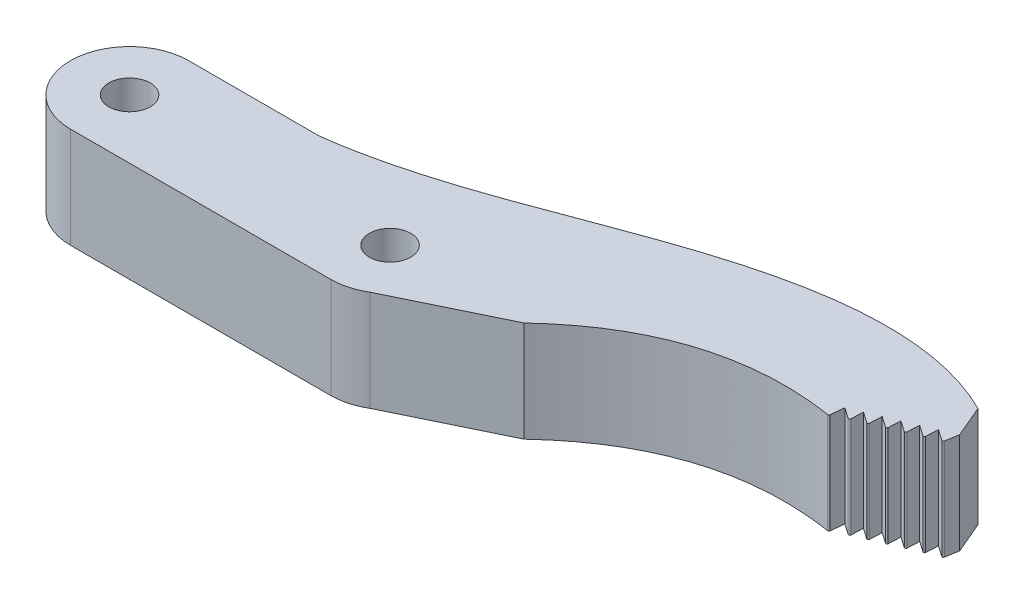
ISO-10303-21;
HEADER;
FILE_DESCRIPTION(('STEP AP214'),'2;1');
FILE_NAME('part.step','',(''),(''),'','','');
FILE_SCHEMA(('AUTOMOTIVE_DESIGN { 1 0 10303 214 1 1 1 1 }'));
ENDSEC;
DATA;
#1=APPLICATION_CONTEXT('core data for automotive mechanical design processes');
#2=APPLICATION_PROTOCOL_DEFINITION('international standard','automotive_design',2000,#1);
#3=PRODUCT_CONTEXT('',#1,'mechanical');
#4=PRODUCT('Part','Part','',(#3));
#5=PRODUCT_RELATED_PRODUCT_CATEGORY('part','',(#4));
#6=PRODUCT_DEFINITION_FORMATION('','',#4);
#7=PRODUCT_DEFINITION_CONTEXT('part definition',#1,'design');
#8=PRODUCT_DEFINITION('design','',#6,#7);
#9=PRODUCT_DEFINITION_SHAPE('','',#8);
#10=(LENGTH_UNIT() NAMED_UNIT(*) SI_UNIT(.MILLI.,.METRE.));
#11=(NAMED_UNIT(*) PLANE_ANGLE_UNIT() SI_UNIT($,.RADIAN.));
#12=(NAMED_UNIT(*) SI_UNIT($,.STERADIAN.) SOLID_ANGLE_UNIT());
#13=UNCERTAINTY_MEASURE_WITH_UNIT(LENGTH_MEASURE(1.E-05),#10,'distance_accuracy_value','');
#14=(GEOMETRIC_REPRESENTATION_CONTEXT(3) GLOBAL_UNCERTAINTY_ASSIGNED_CONTEXT((#13)) GLOBAL_UNIT_ASSIGNED_CONTEXT((#10,
#11,#12)) REPRESENTATION_CONTEXT('',''));
#15=CARTESIAN_POINT('',(0.,0.,0.));
#16=DIRECTION('',(0.,0.,1.));
#17=DIRECTION('',(1.,0.,0.));
#18=AXIS2_PLACEMENT_3D('',#15,#16,#17);
#19=CARTESIAN_POINT('',(0.,8.5,0.));
#20=DIRECTION('',(0.,1.,0.));
#21=DIRECTION('',(0.,0.,1.));
#22=AXIS2_PLACEMENT_3D('',#19,#20,#21);
#23=PLANE('',#22);
#24=CARTESIAN_POINT('',(0.,8.5,0.));
#25=DIRECTION('',(0.,1.,0.));
#26=DIRECTION('',(0.,0.,1.));
#27=AXIS2_PLACEMENT_3D('',#24,#25,#26);
#28=CIRCLE('',#27,1.75);
#29=CARTESIAN_POINT('',(0.,8.5,1.75));
#30=VERTEX_POINT('',#29);
#31=EDGE_CURVE('E632',#30,#30,#28,.T.);
#32=ORIENTED_EDGE('',*,*,#31,.F.);
#33=EDGE_LOOP('',(#32));
#34=FACE_BOUND('',#33,.T.);
#35=CARTESIAN_POINT('',(22.,8.5,0.));
#36=DIRECTION('',(0.,1.,0.));
#37=DIRECTION('',(0.,0.,1.));
#38=AXIS2_PLACEMENT_3D('',#35,#36,#37);
#39=CIRCLE('',#38,1.75);
#40=CARTESIAN_POINT('',(22.,8.5,1.75));
#41=VERTEX_POINT('',#40);
#42=EDGE_CURVE('E624',#41,#41,#39,.T.);
#43=ORIENTED_EDGE('',*,*,#42,.F.);
#44=EDGE_LOOP('',(#43));
#45=FACE_BOUND('',#44,.T.);
#46=DIRECTION('',(0.820739161225916,0.,0.571303097514953));
#47=VECTOR('',#46,1.);
#48=CARTESIAN_POINT('',(23.6778354912223,8.5,-34.015791136512));
#49=LINE('',#48,#47);
#50=CARTESIAN_POINT('',(58.6481039931561,8.5,-9.67355957265818));
#51=VERTEX_POINT('',#50);
#52=CARTESIAN_POINT('',(59.5739181305044,8.5,-9.02911550397233));
#53=VERTEX_POINT('',#52);
#54=EDGE_CURVE('E318',#51,#53,#49,.T.);
#55=ORIENTED_EDGE('',*,*,#54,.T.);
#56=CARTESIAN_POINT('',(59.6310484402559,8.5,-9.11118942009492));
#57=DIRECTION('',(0.,1.,0.));
#58=DIRECTION('',(0.,0.,1.));
#59=AXIS2_PLACEMENT_3D('',#56,#57,#58);
#60=CIRCLE('',#59,0.1);
#61=CARTESIAN_POINT('',(59.729767794205,8.5,-9.09523670384068));
#62=VERTEX_POINT('',#61);
#63=EDGE_CURVE('E701',#53,#62,#60,.T.);
#64=ORIENTED_EDGE('',*,*,#63,.T.);
#65=DIRECTION('',(0.159527162542443,0.,-0.987193539490184));
#66=VECTOR('',#65,1.);
#67=CARTESIAN_POINT('',(56.7773540427395,8.5,9.17502984448575));
#68=LINE('',#67,#66);
#69=CARTESIAN_POINT('',(59.9096296005443,8.5,-10.2082660487461));
#70=VERTEX_POINT('',#69);
#71=EDGE_CURVE('E370',#62,#70,#68,.T.);
#72=ORIENTED_EDGE('',*,*,#71,.T.);
#73=DIRECTION('',(-0.39024909973652,0.,-0.920709313602744));
#74=VECTOR('',#73,1.);
#75=CARTESIAN_POINT('',(60.3346865912055,8.5,-9.20543495860924));
#76=LINE('',#75,#74);
#77=CARTESIAN_POINT('',(58.7736901922594,8.5,-12.8882722130202));
#78=VERTEX_POINT('',#77);
#79=EDGE_CURVE('E592',#70,#78,#76,.T.);
#80=ORIENTED_EDGE('',*,*,#79,.T.);
#81=CARTESIAN_POINT('',(58.7736901922594,8.5,-12.8882722130202));
#82=CARTESIAN_POINT('',(52.7742242431908,8.5,-15.8907993993144));
#83=CARTESIAN_POINT('',(35.6036156525737,8.5,-14.5978462371183));
#84=CARTESIAN_POINT('',(21.1527610788369,8.5,-6.29600031117131));
#85=CARTESIAN_POINT('',(11.,8.5,-5.));
#86=B_SPLINE_CURVE_WITH_KNOTS('',3,(#81,#82,#83,#84,#85),.UNSPECIFIED.,.F.,.F.,(4,1,4),(0.,
0.39213618372464,1.),.UNSPECIFIED.);
#87=CARTESIAN_POINT('',(11.,8.5,-5.));
#88=VERTEX_POINT('',#87);
#89=EDGE_CURVE('E439',#78,#88,#86,.T.);
#90=ORIENTED_EDGE('',*,*,#89,.T.);
#91=DIRECTION('',(-1.,0.,0.));
#92=VECTOR('',#91,1.);
#93=CARTESIAN_POINT('',(0.,8.5,-5.));
#94=LINE('',#93,#92);
#95=CARTESIAN_POINT('',(0.,8.5,-5.));
#96=VERTEX_POINT('',#95);
#97=EDGE_CURVE('E651',#88,#96,#94,.T.);
#98=ORIENTED_EDGE('',*,*,#97,.T.);
#99=CARTESIAN_POINT('',(0.,8.5,0.));
#100=DIRECTION('',(0.,1.,0.));
#101=DIRECTION('',(0.,0.,1.));
#102=AXIS2_PLACEMENT_3D('',#99,#100,#101);
#103=CIRCLE('',#102,5.);
#104=CARTESIAN_POINT('',(0.,8.5,5.));
#105=VERTEX_POINT('',#104);
#106=EDGE_CURVE('E640',#96,#105,#103,.T.);
#107=ORIENTED_EDGE('',*,*,#106,.T.);
#108=DIRECTION('',(1.,0.,0.));
#109=VECTOR('',#108,1.);
#110=CARTESIAN_POINT('',(0.,8.5,5.));
#111=LINE('',#110,#109);
#112=CARTESIAN_POINT('',(22.,8.5,5.));
#113=VERTEX_POINT('',#112);
#114=EDGE_CURVE('E644',#105,#113,#111,.T.);
#115=ORIENTED_EDGE('',*,*,#114,.T.);
#116=CARTESIAN_POINT('',(22.,8.5,0.));
#117=DIRECTION('',(0.,1.,0.));
#118=DIRECTION('',(0.,0.,1.));
#119=AXIS2_PLACEMENT_3D('',#116,#117,#118);
#120=CIRCLE('',#119,5.);
#121=CARTESIAN_POINT('',(24.5933863620115,8.5,4.27485054444392));
#122=VERTEX_POINT('',#121);
#123=EDGE_CURVE('E648',#113,#122,#120,.T.);
#124=ORIENTED_EDGE('',*,*,#123,.T.);
#125=DIRECTION('',(0.89955777895518,0.,-0.436801788367704));
#126=VECTOR('',#125,1.);
#127=CARTESIAN_POINT('',(24.1790120823835,8.5,4.47605988377656));
#128=LINE('',#127,#126);
#129=CARTESIAN_POINT('',(33.3415575685287,8.5,0.0269668427524081));
#130=VERTEX_POINT('',#129);
#131=EDGE_CURVE('E390',#122,#130,#128,.T.);
#132=ORIENTED_EDGE('',*,*,#131,.T.);
#133=CARTESIAN_POINT('',(33.3415575685287,8.5,0.0269668427524081));
#134=CARTESIAN_POINT('',(41.7498204729618,8.5,-7.89313442016116));
#135=CARTESIAN_POINT('',(52.9690120823835,8.5,-6.08344216071709));
#136=B_SPLINE_CURVE_WITH_KNOTS('',2,(#133,#134,#135),.UNSPECIFIED.,.F.,.F.,(3,3),(0.,1.),.UNSPECIFIED.);
#137=CARTESIAN_POINT('',(52.8645896871265,8.5,-6.10008469831257));
#138=VERTEX_POINT('',#137);
#139=EDGE_CURVE('E586',#130,#138,#136,.T.);
#140=ORIENTED_EDGE('',*,*,#139,.T.);
#141=CARTESIAN_POINT('',(52.8801429505113,8.5,-6.19886777377635));
#142=DIRECTION('',(0.,1.,0.));
#143=DIRECTION('',(0.,0.,1.));
#144=AXIS2_PLACEMENT_3D('',#141,#142,#143);
#145=CIRCLE('',#144,0.1);
#146=CARTESIAN_POINT('',(52.9796385017408,8.5,-6.18883605978845));
#147=VERTEX_POINT('',#146);
#148=EDGE_CURVE('E588',#138,#147,#145,.T.);
#149=ORIENTED_EDGE('',*,*,#148,.T.);
#150=DIRECTION('',(0.100317139878992,0.,-0.994955512295147));
#151=VECTOR('',#150,1.);
#152=CARTESIAN_POINT('',(51.8287619159183,8.5,5.2256740071528));
#153=LINE('',#152,#151);
#154=CARTESIAN_POINT('',(53.0936133138799,8.5,-7.31924974320675));
#155=VERTEX_POINT('',#154);
#156=EDGE_CURVE('E376',#147,#155,#153,.T.);
#157=ORIENTED_EDGE('',*,*,#156,.T.);
#158=DIRECTION('',(0.8242757676216,0.,0.566188536542221));
#159=VECTOR('',#158,1.);
#160=CARTESIAN_POINT('',(20.4360517412647,8.5,-29.7514717254073));
#161=LINE('',#160,#159);
#162=CARTESIAN_POINT('',(54.0082692399699,8.5,-6.69097978723458));
#163=VERTEX_POINT('',#162);
#164=EDGE_CURVE('E380',#155,#163,#161,.T.);
#165=ORIENTED_EDGE('',*,*,#164,.T.);
#166=CARTESIAN_POINT('',(54.0648880936241,8.5,-6.77340736399674));
#167=DIRECTION('',(0.,1.,0.));
#168=DIRECTION('',(0.,0.,1.));
#169=AXIS2_PLACEMENT_3D('',#166,#167,#168);
#170=CIRCLE('',#169,0.1);
#171=CARTESIAN_POINT('',(54.1648307920072,8.5,-6.77002253905194));
#172=VERTEX_POINT('',#171);
#173=EDGE_CURVE('E686',#163,#172,#170,.T.);
#174=ORIENTED_EDGE('',*,*,#173,.T.);
#175=DIRECTION('',(0.0338482494481111,0.,-0.999426983830884));
#176=VECTOR('',#175,1.);
#177=CARTESIAN_POINT('',(53.8737518261521,8.5,1.82457770304288));
#178=LINE('',#177,#176);
#179=CARTESIAN_POINT('',(54.1993040690976,8.5,-7.78790452429312));
#180=VERTEX_POINT('',#179);
#181=EDGE_CURVE('E358',#172,#180,#178,.T.);
#182=ORIENTED_EDGE('',*,*,#181,.T.);
#183=DIRECTION('',(0.820739161225914,0.,0.571303097514955));
#184=VECTOR('',#183,1.);
#185=CARTESIAN_POINT('',(21.3416376592027,8.5,-30.6595883477472));
#186=LINE('',#185,#184);
#187=CARTESIAN_POINT('',(55.1069626425986,8.5,-7.1560982464586));
#188=VERTEX_POINT('',#187);
#189=EDGE_CURVE('E352',#180,#188,#186,.T.);
#190=ORIENTED_EDGE('',*,*,#189,.T.);
#191=CARTESIAN_POINT('',(55.1640929523501,8.5,-7.2381721625812));
#192=DIRECTION('',(0.,1.,0.));
#193=DIRECTION('',(0.,0.,1.));
#194=AXIS2_PLACEMENT_3D('',#191,#192,#193);
#195=CIRCLE('',#194,0.1);
#196=CARTESIAN_POINT('',(55.2639858277884,8.5,-7.23354469711193));
#197=VERTEX_POINT('',#196);
#198=EDGE_CURVE('E689',#188,#197,#195,.T.);
#199=ORIENTED_EDGE('',*,*,#198,.T.);
#200=DIRECTION('',(0.0462746546926032,0.,-0.998928754382954));
#201=VECTOR('',#200,1.);
#202=CARTESIAN_POINT('',(54.811275436478,8.5,2.53909283615619));
#203=LINE('',#202,#201);
#204=CARTESIAN_POINT('',(55.3115040501122,8.5,-8.25931828638438));
#205=VERTEX_POINT('',#204);
#206=EDGE_CURVE('E396',#197,#205,#203,.T.);
#207=ORIENTED_EDGE('',*,*,#206,.T.);
#208=DIRECTION('',(0.820739161225915,0.,0.571303097514954));
#209=VECTOR('',#208,1.);
#210=CARTESIAN_POINT('',(21.9256871172076,8.5,-31.4986390449384));
#211=LINE('',#210,#209);
#212=CARTESIAN_POINT('',(56.2191626236133,8.5,-7.62751200854987));
#213=VERTEX_POINT('',#212);
#214=EDGE_CURVE('E399',#205,#213,#211,.T.);
#215=ORIENTED_EDGE('',*,*,#214,.T.);
#216=CARTESIAN_POINT('',(56.2762929333648,8.5,-7.70958592467246));
#217=DIRECTION('',(0.,1.,0.));
#218=DIRECTION('',(0.,0.,1.));
#219=AXIS2_PLACEMENT_3D('',#216,#217,#218);
#220=CIRCLE('',#219,0.1);
#221=CARTESIAN_POINT('',(56.3761858088031,8.5,-7.7049584592032));
#222=VERTEX_POINT('',#221);
#223=EDGE_CURVE('E692',#213,#222,#220,.T.);
#224=ORIENTED_EDGE('',*,*,#223,.T.);
#225=DIRECTION('',(0.0462746546926031,0.,-0.998928754382954));
#226=VECTOR('',#225,1.);
#227=CARTESIAN_POINT('',(55.899302674746,8.5,2.58949491390806));
#228=LINE('',#227,#226);
#229=CARTESIAN_POINT('',(56.4237040311268,8.5,-8.73073204847565));
#230=VERTEX_POINT('',#229);
#231=EDGE_CURVE('E341',#222,#230,#228,.T.);
#232=ORIENTED_EDGE('',*,*,#231,.T.);
#233=DIRECTION('',(0.820739161225914,0.,0.571303097514955));
#234=VECTOR('',#233,1.);
#235=CARTESIAN_POINT('',(22.5097365752126,8.5,-32.3376897421296));
#236=LINE('',#235,#234);
#237=CARTESIAN_POINT('',(57.3313626046279,8.5,-8.09892577064114));
#238=VERTEX_POINT('',#237);
#239=EDGE_CURVE('E320',#230,#238,#236,.T.);
#240=ORIENTED_EDGE('',*,*,#239,.T.);
#241=CARTESIAN_POINT('',(57.3884929143794,8.5,-8.18099968676373));
#242=DIRECTION('',(0.,1.,0.));
#243=DIRECTION('',(0.,0.,1.));
#244=AXIS2_PLACEMENT_3D('',#241,#242,#243);
#245=CIRCLE('',#244,0.1);
#246=CARTESIAN_POINT('',(57.4883857898177,8.5,-8.17637222129447));
#247=VERTEX_POINT('',#246);
#248=EDGE_CURVE('E695',#238,#247,#245,.T.);
#249=ORIENTED_EDGE('',*,*,#248,.T.);
#250=DIRECTION('',(0.0462746546926033,0.,-0.998928754382954));
#251=VECTOR('',#250,1.);
#252=CARTESIAN_POINT('',(56.9873299130141,8.5,2.63989699165996));
#253=LINE('',#252,#251);
#254=CARTESIAN_POINT('',(57.5359040121415,8.5,-9.20214581056691));
#255=VERTEX_POINT('',#254);
#256=EDGE_CURVE('E414',#247,#255,#253,.T.);
#257=ORIENTED_EDGE('',*,*,#256,.T.);
#258=DIRECTION('',(0.820739161225915,0.,0.571303097514954));
#259=VECTOR('',#258,1.);
#260=CARTESIAN_POINT('',(23.0937860332174,8.5,-33.1767404393208));
#261=LINE('',#260,#259);
#262=CARTESIAN_POINT('',(58.4435625856425,8.5,-8.5703395327324));
#263=VERTEX_POINT('',#262);
#264=EDGE_CURVE('E417',#255,#263,#261,.T.);
#265=ORIENTED_EDGE('',*,*,#264,.T.);
#266=CARTESIAN_POINT('',(58.500692895394,8.5,-8.65241344885499));
#267=DIRECTION('',(0.,1.,0.));
#268=DIRECTION('',(0.,0.,1.));
#269=AXIS2_PLACEMENT_3D('',#266,#267,#268);
#270=CIRCLE('',#269,0.1);
#271=CARTESIAN_POINT('',(58.6005857708323,8.5,-8.64778598338573));
#272=VERTEX_POINT('',#271);
#273=EDGE_CURVE('E698',#263,#272,#270,.T.);
#274=ORIENTED_EDGE('',*,*,#273,.T.);
#275=DIRECTION('',(0.0462746546926032,0.,-0.998928754382954));
#276=VECTOR('',#275,1.);
#277=CARTESIAN_POINT('',(58.0753571512821,8.5,2.69029906941183));
#278=LINE('',#277,#276);
#279=EDGE_CURVE('E327',#272,#51,#278,.T.);
#280=ORIENTED_EDGE('',*,*,#279,.T.);
#281=EDGE_LOOP('',(#55,#64,#72,#80,#90,#98,#107,#115,#124,#132,#140,#149,#157,#165,#174,#182,
#190,#199,#207,#215,#224,#232,#240,#249,#257,#265,#274,#280));
#282=FACE_BOUND('',#281,.T.);
#283=ADVANCED_FACE('F113',(#34,#45,#282),#23,.T.);
#284=CARTESIAN_POINT('',(0.,0.,0.));
#285=DIRECTION('',(0.,1.,0.));
#286=DIRECTION('',(0.,0.,1.));
#287=AXIS2_PLACEMENT_3D('',#284,#285,#286);
#288=PLANE('',#287);
#289=CARTESIAN_POINT('',(22.,0.,0.));
#290=DIRECTION('',(0.,1.,0.));
#291=DIRECTION('',(0.,0.,1.));
#292=AXIS2_PLACEMENT_3D('',#289,#290,#291);
#293=CIRCLE('',#292,1.75);
#294=CARTESIAN_POINT('',(22.,0.,1.75));
#295=VERTEX_POINT('',#294);
#296=EDGE_CURVE('E615',#295,#295,#293,.T.);
#297=ORIENTED_EDGE('',*,*,#296,.T.);
#298=EDGE_LOOP('',(#297));
#299=FACE_BOUND('',#298,.T.);
#300=CARTESIAN_POINT('',(0.,0.,0.));
#301=DIRECTION('',(0.,1.,0.));
#302=DIRECTION('',(0.,0.,1.));
#303=AXIS2_PLACEMENT_3D('',#300,#301,#302);
#304=CIRCLE('',#303,1.75);
#305=CARTESIAN_POINT('',(0.,0.,1.75));
#306=VERTEX_POINT('',#305);
#307=EDGE_CURVE('E628',#306,#306,#304,.T.);
#308=ORIENTED_EDGE('',*,*,#307,.T.);
#309=EDGE_LOOP('',(#308));
#310=FACE_BOUND('',#309,.T.);
#311=DIRECTION('',(0.159527162542443,0.,-0.987193539490184));
#312=VECTOR('',#311,1.);
#313=CARTESIAN_POINT('',(56.7773540427395,0.,9.17502984448575));
#314=LINE('',#313,#312);
#315=CARTESIAN_POINT('',(59.729767794205,0.,-9.09523670384068));
#316=VERTEX_POINT('',#315);
#317=CARTESIAN_POINT('',(59.9096296005443,0.,-10.2082660487461));
#318=VERTEX_POINT('',#317);
#319=EDGE_CURVE('E427',#316,#318,#314,.T.);
#320=ORIENTED_EDGE('',*,*,#319,.F.);
#321=CARTESIAN_POINT('',(59.6310484402559,0.,-9.11118942009492));
#322=DIRECTION('',(0.,1.,0.));
#323=DIRECTION('',(0.,0.,1.));
#324=AXIS2_PLACEMENT_3D('',#321,#322,#323);
#325=CIRCLE('',#324,0.1);
#326=CARTESIAN_POINT('',(59.5739181305044,0.,-9.02911550397233));
#327=VERTEX_POINT('',#326);
#328=EDGE_CURVE('E325',#316,#327,#325,.F.);
#329=ORIENTED_EDGE('',*,*,#328,.T.);
#330=DIRECTION('',(0.820739161225916,0.,0.571303097514953));
#331=VECTOR('',#330,1.);
#332=CARTESIAN_POINT('',(23.6778354912223,0.,-34.015791136512));
#333=LINE('',#332,#331);
#334=CARTESIAN_POINT('',(58.6481039931561,0.,-9.67355957265818));
#335=VERTEX_POINT('',#334);
#336=EDGE_CURVE('E310',#335,#327,#333,.T.);
#337=ORIENTED_EDGE('',*,*,#336,.F.);
#338=DIRECTION('',(0.0462746546926032,0.,-0.998928754382954));
#339=VECTOR('',#338,1.);
#340=CARTESIAN_POINT('',(58.0753571512821,0.,2.69029906941183));
#341=LINE('',#340,#339);
#342=CARTESIAN_POINT('',(58.6005857708323,0.,-8.64778598338573));
#343=VERTEX_POINT('',#342);
#344=EDGE_CURVE('E299',#343,#335,#341,.T.);
#345=ORIENTED_EDGE('',*,*,#344,.F.);
#346=CARTESIAN_POINT('',(58.500692895394,0.,-8.65241344885499));
#347=DIRECTION('',(0.,1.,0.));
#348=DIRECTION('',(0.,0.,1.));
#349=AXIS2_PLACEMENT_3D('',#346,#347,#348);
#350=CIRCLE('',#349,0.1);
#351=CARTESIAN_POINT('',(58.4435625856425,0.,-8.5703395327324));
#352=VERTEX_POINT('',#351);
#353=EDGE_CURVE('E543',#343,#352,#350,.F.);
#354=ORIENTED_EDGE('',*,*,#353,.T.);
#355=DIRECTION('',(0.820739161225915,0.,0.571303097514954));
#356=VECTOR('',#355,1.);
#357=CARTESIAN_POINT('',(23.0937860332174,0.,-33.1767404393208));
#358=LINE('',#357,#356);
#359=CARTESIAN_POINT('',(57.5359040121415,0.,-9.20214581056691));
#360=VERTEX_POINT('',#359);
#361=EDGE_CURVE('E409',#360,#352,#358,.T.);
#362=ORIENTED_EDGE('',*,*,#361,.F.);
#363=DIRECTION('',(0.0462746546926033,0.,-0.998928754382954));
#364=VECTOR('',#363,1.);
#365=CARTESIAN_POINT('',(56.9873299130141,0.,2.63989699165996));
#366=LINE('',#365,#364);
#367=CARTESIAN_POINT('',(57.4883857898177,0.,-8.17637222129447));
#368=VERTEX_POINT('',#367);
#369=EDGE_CURVE('E413',#368,#360,#366,.T.);
#370=ORIENTED_EDGE('',*,*,#369,.F.);
#371=CARTESIAN_POINT('',(57.3884929143794,0.,-8.18099968676373));
#372=DIRECTION('',(0.,1.,0.));
#373=DIRECTION('',(0.,0.,1.));
#374=AXIS2_PLACEMENT_3D('',#371,#372,#373);
#375=CIRCLE('',#374,0.1);
#376=CARTESIAN_POINT('',(57.3313626046279,0.,-8.09892577064114));
#377=VERTEX_POINT('',#376);
#378=EDGE_CURVE('E541',#368,#377,#375,.F.);
#379=ORIENTED_EDGE('',*,*,#378,.T.);
#380=DIRECTION('',(0.820739161225914,0.,0.571303097514955));
#381=VECTOR('',#380,1.);
#382=CARTESIAN_POINT('',(22.5097365752126,0.,-32.3376897421296));
#383=LINE('',#382,#381);
#384=CARTESIAN_POINT('',(56.4237040311268,0.,-8.73073204847565));
#385=VERTEX_POINT('',#384);
#386=EDGE_CURVE('E336',#385,#377,#383,.T.);
#387=ORIENTED_EDGE('',*,*,#386,.F.);
#388=DIRECTION('',(0.0462746546926031,0.,-0.998928754382954));
#389=VECTOR('',#388,1.);
#390=CARTESIAN_POINT('',(55.899302674746,0.,2.58949491390806));
#391=LINE('',#390,#389);
#392=CARTESIAN_POINT('',(56.3761858088031,0.,-7.7049584592032));
#393=VERTEX_POINT('',#392);
#394=EDGE_CURVE('E340',#393,#385,#391,.T.);
#395=ORIENTED_EDGE('',*,*,#394,.F.);
#396=CARTESIAN_POINT('',(56.2762929333648,0.,-7.70958592467246));
#397=DIRECTION('',(0.,1.,0.));
#398=DIRECTION('',(0.,0.,1.));
#399=AXIS2_PLACEMENT_3D('',#396,#397,#398);
#400=CIRCLE('',#399,0.1);
#401=CARTESIAN_POINT('',(56.2191626236133,0.,-7.62751200854987));
#402=VERTEX_POINT('',#401);
#403=EDGE_CURVE('E532',#393,#402,#400,.F.);
#404=ORIENTED_EDGE('',*,*,#403,.T.);
#405=DIRECTION('',(0.820739161225915,0.,0.571303097514954));
#406=VECTOR('',#405,1.);
#407=CARTESIAN_POINT('',(21.9256871172076,0.,-31.4986390449384));
#408=LINE('',#407,#406);
#409=CARTESIAN_POINT('',(55.3115040501122,0.,-8.25931828638438));
#410=VERTEX_POINT('',#409);
#411=EDGE_CURVE('E391',#410,#402,#408,.T.);
#412=ORIENTED_EDGE('',*,*,#411,.F.);
#413=DIRECTION('',(0.0462746546926032,0.,-0.998928754382954));
#414=VECTOR('',#413,1.);
#415=CARTESIAN_POINT('',(54.811275436478,0.,2.53909283615619));
#416=LINE('',#415,#414);
#417=CARTESIAN_POINT('',(55.2639858277884,0.,-7.23354469711193));
#418=VERTEX_POINT('',#417);
#419=EDGE_CURVE('E395',#418,#410,#416,.T.);
#420=ORIENTED_EDGE('',*,*,#419,.F.);
#421=CARTESIAN_POINT('',(55.1640929523501,0.,-7.2381721625812));
#422=DIRECTION('',(0.,1.,0.));
#423=DIRECTION('',(0.,0.,1.));
#424=AXIS2_PLACEMENT_3D('',#421,#422,#423);
#425=CIRCLE('',#424,0.1);
#426=CARTESIAN_POINT('',(55.1069626425986,0.,-7.1560982464586));
#427=VERTEX_POINT('',#426);
#428=EDGE_CURVE('E529',#418,#427,#425,.F.);
#429=ORIENTED_EDGE('',*,*,#428,.T.);
#430=DIRECTION('',(0.820739161225914,0.,0.571303097514955));
#431=VECTOR('',#430,1.);
#432=CARTESIAN_POINT('',(21.3416376592027,0.,-30.6595883477472));
#433=LINE('',#432,#431);
#434=CARTESIAN_POINT('',(54.1993040690976,0.,-7.78790452429312));
#435=VERTEX_POINT('',#434);
#436=EDGE_CURVE('E353',#435,#427,#433,.T.);
#437=ORIENTED_EDGE('',*,*,#436,.F.);
#438=DIRECTION('',(0.0338482494481111,0.,-0.999426983830884));
#439=VECTOR('',#438,1.);
#440=CARTESIAN_POINT('',(53.8737518261521,0.,1.82457770304288));
#441=LINE('',#440,#439);
#442=CARTESIAN_POINT('',(54.1648307920072,0.,-6.77002253905194));
#443=VERTEX_POINT('',#442);
#444=EDGE_CURVE('E357',#443,#435,#441,.T.);
#445=ORIENTED_EDGE('',*,*,#444,.F.);
#446=CARTESIAN_POINT('',(54.0648880936241,0.,-6.77340736399674));
#447=DIRECTION('',(0.,1.,0.));
#448=DIRECTION('',(0.,0.,1.));
#449=AXIS2_PLACEMENT_3D('',#446,#447,#448);
#450=CIRCLE('',#449,0.1);
#451=CARTESIAN_POINT('',(54.0082692399699,0.,-6.69097978723458));
#452=VERTEX_POINT('',#451);
#453=EDGE_CURVE('E522',#443,#452,#450,.F.);
#454=ORIENTED_EDGE('',*,*,#453,.T.);
#455=DIRECTION('',(0.8242757676216,0.,0.566188536542221));
#456=VECTOR('',#455,1.);
#457=CARTESIAN_POINT('',(20.4360517412647,0.,-29.7514717254073));
#458=LINE('',#457,#456);
#459=CARTESIAN_POINT('',(53.0936133138799,0.,-7.31924974320675));
#460=VERTEX_POINT('',#459);
#461=EDGE_CURVE('E371',#460,#452,#458,.T.);
#462=ORIENTED_EDGE('',*,*,#461,.F.);
#463=DIRECTION('',(0.100317139878992,0.,-0.994955512295147));
#464=VECTOR('',#463,1.);
#465=CARTESIAN_POINT('',(51.8287619159183,0.,5.2256740071528));
#466=LINE('',#465,#464);
#467=CARTESIAN_POINT('',(52.9796385017408,0.,-6.18883605978845));
#468=VERTEX_POINT('',#467);
#469=EDGE_CURVE('E375',#468,#460,#466,.T.);
#470=ORIENTED_EDGE('',*,*,#469,.F.);
#471=CARTESIAN_POINT('',(52.8801429505113,0.,-6.19886777377635));
#472=DIRECTION('',(0.,1.,0.));
#473=DIRECTION('',(0.,0.,1.));
#474=AXIS2_PLACEMENT_3D('',#471,#472,#473);
#475=CIRCLE('',#474,0.1);
#476=CARTESIAN_POINT('',(52.8645896871265,0.,-6.10008469831257));
#477=VERTEX_POINT('',#476);
#478=EDGE_CURVE('E129',#468,#477,#475,.F.);
#479=ORIENTED_EDGE('',*,*,#478,.T.);
#480=CARTESIAN_POINT('',(33.3415575685287,0.,0.0269668427524081));
#481=CARTESIAN_POINT('',(41.7498204729618,0.,-7.89313442016116));
#482=CARTESIAN_POINT('',(52.9690120823835,0.,-6.08344216071709));
#483=B_SPLINE_CURVE_WITH_KNOTS('',2,(#480,#481,#482),.UNSPECIFIED.,.F.,.F.,(3,3),(0.,1.),.UNSPECIFIED.);
#484=CARTESIAN_POINT('',(33.3415575685287,0.,0.0269668427524081));
#485=VERTEX_POINT('',#484);
#486=EDGE_CURVE('E438',#485,#477,#483,.T.);
#487=ORIENTED_EDGE('',*,*,#486,.F.);
#488=DIRECTION('',(0.89955777895518,0.,-0.436801788367704));
#489=VECTOR('',#488,1.);
#490=CARTESIAN_POINT('',(24.1790120823835,0.,4.47605988377656));
#491=LINE('',#490,#489);
#492=CARTESIAN_POINT('',(24.5933863620115,0.,4.27485054444392));
#493=VERTEX_POINT('',#492);
#494=EDGE_CURVE('E435',#493,#485,#491,.T.);
#495=ORIENTED_EDGE('',*,*,#494,.F.);
#496=CARTESIAN_POINT('',(22.,0.,0.));
#497=DIRECTION('',(0.,1.,0.));
#498=DIRECTION('',(0.,0.,1.));
#499=AXIS2_PLACEMENT_3D('',#496,#497,#498);
#500=CIRCLE('',#499,5.);
#501=CARTESIAN_POINT('',(22.,0.,5.));
#502=VERTEX_POINT('',#501);
#503=EDGE_CURVE('E660',#502,#493,#500,.T.);
#504=ORIENTED_EDGE('',*,*,#503,.F.);
#505=DIRECTION('',(1.,0.,0.));
#506=VECTOR('',#505,1.);
#507=CARTESIAN_POINT('',(0.,0.,5.));
#508=LINE('',#507,#506);
#509=CARTESIAN_POINT('',(0.,0.,5.));
#510=VERTEX_POINT('',#509);
#511=EDGE_CURVE('E658',#510,#502,#508,.T.);
#512=ORIENTED_EDGE('',*,*,#511,.F.);
#513=CARTESIAN_POINT('',(0.,0.,0.));
#514=DIRECTION('',(0.,1.,0.));
#515=DIRECTION('',(0.,0.,1.));
#516=AXIS2_PLACEMENT_3D('',#513,#514,#515);
#517=CIRCLE('',#516,5.);
#518=CARTESIAN_POINT('',(0.,0.,-5.));
#519=VERTEX_POINT('',#518);
#520=EDGE_CURVE('E636',#519,#510,#517,.T.);
#521=ORIENTED_EDGE('',*,*,#520,.F.);
#522=DIRECTION('',(-1.,0.,0.));
#523=VECTOR('',#522,1.);
#524=CARTESIAN_POINT('',(0.,0.,-5.));
#525=LINE('',#524,#523);
#526=CARTESIAN_POINT('',(11.,0.,-5.));
#527=VERTEX_POINT('',#526);
#528=EDGE_CURVE('E645',#527,#519,#525,.T.);
#529=ORIENTED_EDGE('',*,*,#528,.F.);
#530=CARTESIAN_POINT('',(58.7736901922594,0.,-12.8882722130202));
#531=CARTESIAN_POINT('',(52.7742242431908,0.,-15.8907993993144));
#532=CARTESIAN_POINT('',(35.6036156525737,0.,-14.5978462371183));
#533=CARTESIAN_POINT('',(21.1527610788369,0.,-6.29600031117131));
#534=CARTESIAN_POINT('',(11.,0.,-5.));
#535=B_SPLINE_CURVE_WITH_KNOTS('',3,(#530,#531,#532,#533,#534),.UNSPECIFIED.,.F.,.F.,(4,1,4),
(0.,0.39213618372464,1.),.UNSPECIFIED.);
#536=CARTESIAN_POINT('',(58.7736901922594,0.,-12.8882722130202));
#537=VERTEX_POINT('',#536);
#538=EDGE_CURVE('E623',#537,#527,#535,.T.);
#539=ORIENTED_EDGE('',*,*,#538,.F.);
#540=DIRECTION('',(-0.39024909973652,0.,-0.920709313602744));
#541=VECTOR('',#540,1.);
#542=CARTESIAN_POINT('',(60.3346865912055,0.,-9.20543495860924));
#543=LINE('',#542,#541);
#544=EDGE_CURVE('E445',#318,#537,#543,.T.);
#545=ORIENTED_EDGE('',*,*,#544,.F.);
#546=EDGE_LOOP('',(#320,#329,#337,#345,#354,#362,#370,#379,#387,#395,#404,#412,#420,#429,#437,
#445,#454,#462,#470,#479,#487,#495,#504,#512,#521,#529,#539,#545));
#547=FACE_BOUND('',#546,.T.);
#548=ADVANCED_FACE('F323',(#299,#310,#547),#288,.F.);
#549=CARTESIAN_POINT('',(60.3346865912055,0.,-9.20543495860924));
#550=DIRECTION('',(0.920709313602744,0.,-0.39024909973652));
#551=DIRECTION('',(-0.39024909973652,0.,-0.920709313602744));
#552=AXIS2_PLACEMENT_3D('',#549,#550,#551);
#553=PLANE('',#552);
#554=ORIENTED_EDGE('',*,*,#79,.F.);
#555=DIRECTION('',(0.,1.,0.));
#556=VECTOR('',#555,1.);
#557=CARTESIAN_POINT('',(59.9096296005443,0.,-10.2082660487461));
#558=LINE('',#557,#556);
#559=EDGE_CURVE('E421',#318,#70,#558,.T.);
#560=ORIENTED_EDGE('',*,*,#559,.F.);
#561=ORIENTED_EDGE('',*,*,#544,.T.);
#562=DIRECTION('',(0.,1.,0.));
#563=VECTOR('',#562,1.);
#564=CARTESIAN_POINT('',(58.7736901922594,0.,-12.8882722130202));
#565=LINE('',#564,#563);
#566=EDGE_CURVE('E616',#537,#78,#565,.T.);
#567=ORIENTED_EDGE('',*,*,#566,.T.);
#568=EDGE_LOOP('',(#554,#560,#561,#567));
#569=FACE_BOUND('',#568,.T.);
#570=ADVANCED_FACE('F458',(#569),#553,.T.);
#571=CARTESIAN_POINT('',(0.,8.5,0.));
#572=DIRECTION('',(0.,-1.,0.));
#573=DIRECTION('',(0.,0.,-1.));
#574=AXIS2_PLACEMENT_3D('',#571,#572,#573);
#575=CYLINDRICAL_SURFACE('',#574,5.);
#576=ORIENTED_EDGE('',*,*,#520,.T.);
#577=DIRECTION('',(0.,-1.,0.));
#578=VECTOR('',#577,1.);
#579=CARTESIAN_POINT('',(0.,8.5,5.));
#580=LINE('',#579,#578);
#581=EDGE_CURVE('E673',#105,#510,#580,.T.);
#582=ORIENTED_EDGE('',*,*,#581,.F.);
#583=ORIENTED_EDGE('',*,*,#106,.F.);
#584=DIRECTION('',(0.,-1.,0.));
#585=VECTOR('',#584,1.);
#586=CARTESIAN_POINT('',(0.,8.5,-5.));
#587=LINE('',#586,#585);
#588=EDGE_CURVE('E654',#96,#519,#587,.T.);
#589=ORIENTED_EDGE('',*,*,#588,.T.);
#590=EDGE_LOOP('',(#576,#582,#583,#589));
#591=FACE_BOUND('',#590,.T.);
#592=ADVANCED_FACE('F489',(#591),#575,.T.);
#593=CARTESIAN_POINT('',(0.,8.5,5.));
#594=DIRECTION('',(0.,0.,-1.));
#595=DIRECTION('',(-1.,0.,0.));
#596=AXIS2_PLACEMENT_3D('',#593,#594,#595);
#597=PLANE('',#596);
#598=ORIENTED_EDGE('',*,*,#511,.T.);
#599=DIRECTION('',(0.,-1.,0.));
#600=VECTOR('',#599,1.);
#601=CARTESIAN_POINT('',(22.,8.5,5.));
#602=LINE('',#601,#600);
#603=EDGE_CURVE('E669',#113,#502,#602,.T.);
#604=ORIENTED_EDGE('',*,*,#603,.F.);
#605=ORIENTED_EDGE('',*,*,#114,.F.);
#606=ORIENTED_EDGE('',*,*,#581,.T.);
#607=EDGE_LOOP('',(#598,#604,#605,#606));
#608=FACE_BOUND('',#607,.T.);
#609=ADVANCED_FACE('F485',(#608),#597,.F.);
#610=CARTESIAN_POINT('',(22.,8.5,0.));
#611=DIRECTION('',(0.,-1.,0.));
#612=DIRECTION('',(0.,0.,-1.));
#613=AXIS2_PLACEMENT_3D('',#610,#611,#612);
#614=CYLINDRICAL_SURFACE('',#613,5.);
#615=ORIENTED_EDGE('',*,*,#503,.T.);
#616=DIRECTION('',(0.,-1.,0.));
#617=VECTOR('',#616,1.);
#618=CARTESIAN_POINT('',(24.5933863620115,8.5,4.27485054444393));
#619=LINE('',#618,#617);
#620=EDGE_CURVE('E677',#493,#122,#619,.F.);
#621=ORIENTED_EDGE('',*,*,#620,.T.);
#622=ORIENTED_EDGE('',*,*,#123,.F.);
#623=ORIENTED_EDGE('',*,*,#603,.T.);
#624=EDGE_LOOP('',(#615,#621,#622,#623));
#625=FACE_BOUND('',#624,.T.);
#626=ADVANCED_FACE('F481',(#625),#614,.T.);
#627=CARTESIAN_POINT('',(0.,8.5,-5.));
#628=DIRECTION('',(0.,0.,1.));
#629=DIRECTION('',(1.,0.,0.));
#630=AXIS2_PLACEMENT_3D('',#627,#628,#629);
#631=PLANE('',#630);
#632=ORIENTED_EDGE('',*,*,#97,.F.);
#633=DIRECTION('',(0.,1.,0.));
#634=VECTOR('',#633,1.);
#635=CARTESIAN_POINT('',(11.,0.,-5.));
#636=LINE('',#635,#634);
#637=EDGE_CURVE('E608',#527,#88,#636,.T.);
#638=ORIENTED_EDGE('',*,*,#637,.F.);
#639=ORIENTED_EDGE('',*,*,#528,.T.);
#640=ORIENTED_EDGE('',*,*,#588,.F.);
#641=EDGE_LOOP('',(#632,#638,#639,#640));
#642=FACE_BOUND('',#641,.T.);
#643=ADVANCED_FACE('F471',(#642),#631,.F.);
#644=CARTESIAN_POINT('',(0.,8.5,0.));
#645=DIRECTION('',(0.,-1.,0.));
#646=DIRECTION('',(0.,0.,-1.));
#647=AXIS2_PLACEMENT_3D('',#644,#645,#646);
#648=CYLINDRICAL_SURFACE('',#647,1.75);
#649=ORIENTED_EDGE('',*,*,#31,.T.);
#650=EDGE_LOOP('',(#649));
#651=FACE_BOUND('',#650,.T.);
#652=ORIENTED_EDGE('',*,*,#307,.F.);
#653=EDGE_LOOP('',(#652));
#654=FACE_BOUND('',#653,.T.);
#655=ADVANCED_FACE('F467',(#651,#654),#648,.F.);
#656=CARTESIAN_POINT('',(22.,8.5,0.));
#657=DIRECTION('',(0.,-1.,0.));
#658=DIRECTION('',(0.,0.,-1.));
#659=AXIS2_PLACEMENT_3D('',#656,#657,#658);
#660=CYLINDRICAL_SURFACE('',#659,1.75);
#661=ORIENTED_EDGE('',*,*,#42,.T.);
#662=EDGE_LOOP('',(#661));
#663=FACE_BOUND('',#662,.T.);
#664=ORIENTED_EDGE('',*,*,#296,.F.);
#665=EDGE_LOOP('',(#664));
#666=FACE_BOUND('',#665,.T.);
#667=ADVANCED_FACE('F463',(#663,#666),#660,.F.);
#668=CARTESIAN_POINT('',(24.1790120823835,0.,4.47605988377656));
#669=DIRECTION('',(0.436801788367704,0.,0.89955777895518));
#670=DIRECTION('',(0.89955777895518,0.,-0.436801788367704));
#671=AXIS2_PLACEMENT_3D('',#668,#669,#670);
#672=PLANE('',#671);
#673=ORIENTED_EDGE('',*,*,#620,.F.);
#674=ORIENTED_EDGE('',*,*,#494,.T.);
#675=DIRECTION('',(0.,1.,0.));
#676=VECTOR('',#675,1.);
#677=CARTESIAN_POINT('',(33.3415575685287,0.,0.0269668427524081));
#678=LINE('',#677,#676);
#679=EDGE_CURVE('E620',#485,#130,#678,.T.);
#680=ORIENTED_EDGE('',*,*,#679,.T.);
#681=ORIENTED_EDGE('',*,*,#131,.F.);
#682=EDGE_LOOP('',(#673,#674,#680,#681));
#683=FACE_BOUND('',#682,.T.);
#684=ADVANCED_FACE('F460',(#683),#672,.T.);
#685=DIRECTION('',(0.,1.,0.));
#686=VECTOR('',#685,1.);
#687=SURFACE_OF_LINEAR_EXTRUSION('',#535,#686);
#688=ORIENTED_EDGE('',*,*,#89,.F.);
#689=ORIENTED_EDGE('',*,*,#566,.F.);
#690=ORIENTED_EDGE('',*,*,#538,.T.);
#691=ORIENTED_EDGE('',*,*,#637,.T.);
#692=EDGE_LOOP('',(#688,#689,#690,#691));
#693=FACE_BOUND('',#692,.T.);
#694=ADVANCED_FACE('F456',(#693),#687,.T.);
#695=DIRECTION('',(0.,1.,0.));
#696=VECTOR('',#695,1.);
#697=SURFACE_OF_LINEAR_EXTRUSION('',#483,#696);
#698=ORIENTED_EDGE('',*,*,#486,.T.);
#699=DIRECTION('',(0.,1.,0.));
#700=VECTOR('',#699,1.);
#701=CARTESIAN_POINT('',(52.8645896871265,0.,-6.10008469831257));
#702=LINE('',#701,#700);
#703=EDGE_CURVE('E122',#477,#138,#702,.T.);
#704=ORIENTED_EDGE('',*,*,#703,.T.);
#705=ORIENTED_EDGE('',*,*,#139,.F.);
#706=ORIENTED_EDGE('',*,*,#679,.F.);
#707=EDGE_LOOP('',(#698,#704,#705,#706));
#708=FACE_BOUND('',#707,.T.);
#709=ADVANCED_FACE('F451',(#708),#697,.T.);
#710=CARTESIAN_POINT('',(20.4360517412647,0.,-29.7514717254073));
#711=DIRECTION('',(-0.566188536542221,0.,0.8242757676216));
#712=DIRECTION('',(0.8242757676216,0.,0.566188536542221));
#713=AXIS2_PLACEMENT_3D('',#710,#711,#712);
#714=PLANE('',#713);
#715=ORIENTED_EDGE('',*,*,#461,.T.);
#716=DIRECTION('',(0.,1.,0.));
#717=VECTOR('',#716,1.);
#718=CARTESIAN_POINT('',(54.0082692399699,0.,-6.69097978723459));
#719=LINE('',#718,#717);
#720=EDGE_CURVE('E525',#452,#163,#719,.T.);
#721=ORIENTED_EDGE('',*,*,#720,.T.);
#722=ORIENTED_EDGE('',*,*,#164,.F.);
#723=DIRECTION('',(0.,1.,0.));
#724=VECTOR('',#723,1.);
#725=CARTESIAN_POINT('',(53.0936133138799,0.,-7.31924974320675));
#726=LINE('',#725,#724);
#727=EDGE_CURVE('E379',#460,#155,#726,.T.);
#728=ORIENTED_EDGE('',*,*,#727,.F.);
#729=EDGE_LOOP('',(#715,#721,#722,#728));
#730=FACE_BOUND('',#729,.T.);
#731=ADVANCED_FACE('F455',(#730),#714,.T.);
#732=CARTESIAN_POINT('',(51.8287619159183,0.,5.2256740071528));
#733=DIRECTION('',(0.994955512295147,0.,0.100317139878992));
#734=DIRECTION('',(0.100317139878992,0.,-0.994955512295147));
#735=AXIS2_PLACEMENT_3D('',#732,#733,#734);
#736=PLANE('',#735);
#737=ORIENTED_EDGE('',*,*,#156,.F.);
#738=DIRECTION('',(0.,1.,0.));
#739=VECTOR('',#738,1.);
#740=CARTESIAN_POINT('',(52.9796385017408,0.,-6.18883605978845));
#741=LINE('',#740,#739);
#742=EDGE_CURVE('E12',#147,#468,#741,.F.);
#743=ORIENTED_EDGE('',*,*,#742,.T.);
#744=ORIENTED_EDGE('',*,*,#469,.T.);
#745=ORIENTED_EDGE('',*,*,#727,.T.);
#746=EDGE_LOOP('',(#737,#743,#744,#745));
#747=FACE_BOUND('',#746,.T.);
#748=ADVANCED_FACE('F764',(#747),#736,.T.);
#749=CARTESIAN_POINT('',(56.7773540427395,0.,9.17502984448575));
#750=DIRECTION('',(0.987193539490184,0.,0.159527162542443));
#751=DIRECTION('',(0.159527162542443,0.,-0.987193539490184));
#752=AXIS2_PLACEMENT_3D('',#749,#750,#751);
#753=PLANE('',#752);
#754=ORIENTED_EDGE('',*,*,#71,.F.);
#755=DIRECTION('',(0.,1.,0.));
#756=VECTOR('',#755,1.);
#757=CARTESIAN_POINT('',(59.729767794205,0.,-9.09523670384067));
#758=LINE('',#757,#756);
#759=EDGE_CURVE('E535',#62,#316,#758,.F.);
#760=ORIENTED_EDGE('',*,*,#759,.T.);
#761=ORIENTED_EDGE('',*,*,#319,.T.);
#762=ORIENTED_EDGE('',*,*,#559,.T.);
#763=EDGE_LOOP('',(#754,#760,#761,#762));
#764=FACE_BOUND('',#763,.T.);
#765=ADVANCED_FACE('F706',(#764),#753,.T.);
#766=CARTESIAN_POINT('',(23.0937860332174,0.,-33.1767404393208));
#767=DIRECTION('',(-0.571303097514954,0.,0.820739161225915));
#768=DIRECTION('',(0.820739161225915,0.,0.571303097514954));
#769=AXIS2_PLACEMENT_3D('',#766,#767,#768);
#770=PLANE('',#769);
#771=ORIENTED_EDGE('',*,*,#361,.T.);
#772=DIRECTION('',(0.,1.,0.));
#773=VECTOR('',#772,1.);
#774=CARTESIAN_POINT('',(58.4435625856425,0.,-8.5703395327324));
#775=LINE('',#774,#773);
#776=EDGE_CURVE('E548',#352,#263,#775,.T.);
#777=ORIENTED_EDGE('',*,*,#776,.T.);
#778=ORIENTED_EDGE('',*,*,#264,.F.);
#779=DIRECTION('',(0.,1.,0.));
#780=VECTOR('',#779,1.);
#781=CARTESIAN_POINT('',(57.5359040121415,0.,-9.20214581056691));
#782=LINE('',#781,#780);
#783=EDGE_CURVE('E403',#360,#255,#782,.T.);
#784=ORIENTED_EDGE('',*,*,#783,.F.);
#785=EDGE_LOOP('',(#771,#777,#778,#784));
#786=FACE_BOUND('',#785,.T.);
#787=ADVANCED_FACE('F715',(#786),#770,.T.);
#788=CARTESIAN_POINT('',(56.9873299130141,0.,2.63989699165996));
#789=DIRECTION('',(0.998928754382954,0.,0.0462746546926033));
#790=DIRECTION('',(0.0462746546926033,0.,-0.998928754382954));
#791=AXIS2_PLACEMENT_3D('',#788,#789,#790);
#792=PLANE('',#791);
#793=ORIENTED_EDGE('',*,*,#256,.F.);
#794=DIRECTION('',(0.,1.,0.));
#795=VECTOR('',#794,1.);
#796=CARTESIAN_POINT('',(57.4883857898177,0.,-8.17637222129447));
#797=LINE('',#796,#795);
#798=EDGE_CURVE('E558',#247,#368,#797,.F.);
#799=ORIENTED_EDGE('',*,*,#798,.T.);
#800=ORIENTED_EDGE('',*,*,#369,.T.);
#801=ORIENTED_EDGE('',*,*,#783,.T.);
#802=EDGE_LOOP('',(#793,#799,#800,#801));
#803=FACE_BOUND('',#802,.T.);
#804=ADVANCED_FACE('F719',(#803),#792,.T.);
#805=CARTESIAN_POINT('',(21.9256871172076,0.,-31.4986390449384));
#806=DIRECTION('',(-0.571303097514954,0.,0.820739161225915));
#807=DIRECTION('',(0.820739161225915,0.,0.571303097514954));
#808=AXIS2_PLACEMENT_3D('',#805,#806,#807);
#809=PLANE('',#808);
#810=ORIENTED_EDGE('',*,*,#411,.T.);
#811=DIRECTION('',(0.,1.,0.));
#812=VECTOR('',#811,1.);
#813=CARTESIAN_POINT('',(56.2191626236133,0.,-7.62751200854987));
#814=LINE('',#813,#812);
#815=EDGE_CURVE('E561',#402,#213,#814,.T.);
#816=ORIENTED_EDGE('',*,*,#815,.T.);
#817=ORIENTED_EDGE('',*,*,#214,.F.);
#818=DIRECTION('',(0.,1.,0.));
#819=VECTOR('',#818,1.);
#820=CARTESIAN_POINT('',(55.3115040501122,0.,-8.25931828638438));
#821=LINE('',#820,#819);
#822=EDGE_CURVE('E384',#410,#205,#821,.T.);
#823=ORIENTED_EDGE('',*,*,#822,.F.);
#824=EDGE_LOOP('',(#810,#816,#817,#823));
#825=FACE_BOUND('',#824,.T.);
#826=ADVANCED_FACE('F738',(#825),#809,.T.);
#827=CARTESIAN_POINT('',(54.811275436478,0.,2.53909283615619));
#828=DIRECTION('',(0.998928754382954,0.,0.0462746546926032));
#829=DIRECTION('',(0.0462746546926032,0.,-0.998928754382954));
#830=AXIS2_PLACEMENT_3D('',#827,#828,#829);
#831=PLANE('',#830);
#832=ORIENTED_EDGE('',*,*,#206,.F.);
#833=DIRECTION('',(0.,1.,0.));
#834=VECTOR('',#833,1.);
#835=CARTESIAN_POINT('',(55.2639858277884,0.,-7.23354469711193));
#836=LINE('',#835,#834);
#837=EDGE_CURVE('E572',#197,#418,#836,.F.);
#838=ORIENTED_EDGE('',*,*,#837,.T.);
#839=ORIENTED_EDGE('',*,*,#419,.T.);
#840=ORIENTED_EDGE('',*,*,#822,.T.);
#841=EDGE_LOOP('',(#832,#838,#839,#840));
#842=FACE_BOUND('',#841,.T.);
#843=ADVANCED_FACE('F743',(#842),#831,.T.);
#844=CARTESIAN_POINT('',(21.3416376592027,0.,-30.6595883477472));
#845=DIRECTION('',(-0.571303097514955,0.,0.820739161225914));
#846=DIRECTION('',(0.820739161225914,0.,0.571303097514955));
#847=AXIS2_PLACEMENT_3D('',#844,#845,#846);
#848=PLANE('',#847);
#849=ORIENTED_EDGE('',*,*,#436,.T.);
#850=DIRECTION('',(0.,1.,0.));
#851=VECTOR('',#850,1.);
#852=CARTESIAN_POINT('',(55.1069626425986,0.,-7.1560982464586));
#853=LINE('',#852,#851);
#854=EDGE_CURVE('E568',#427,#188,#853,.T.);
#855=ORIENTED_EDGE('',*,*,#854,.T.);
#856=ORIENTED_EDGE('',*,*,#189,.F.);
#857=DIRECTION('',(0.,1.,0.));
#858=VECTOR('',#857,1.);
#859=CARTESIAN_POINT('',(54.1993040690976,0.,-7.78790452429312));
#860=LINE('',#859,#858);
#861=EDGE_CURVE('E361',#435,#180,#860,.T.);
#862=ORIENTED_EDGE('',*,*,#861,.F.);
#863=EDGE_LOOP('',(#849,#855,#856,#862));
#864=FACE_BOUND('',#863,.T.);
#865=ADVANCED_FACE('F750',(#864),#848,.T.);
#866=CARTESIAN_POINT('',(53.8737518261521,0.,1.82457770304288));
#867=DIRECTION('',(0.999426983830884,0.,0.0338482494481111));
#868=DIRECTION('',(0.0338482494481111,0.,-0.999426983830884));
#869=AXIS2_PLACEMENT_3D('',#866,#867,#868);
#870=PLANE('',#869);
#871=ORIENTED_EDGE('',*,*,#181,.F.);
#872=DIRECTION('',(0.,1.,0.));
#873=VECTOR('',#872,1.);
#874=CARTESIAN_POINT('',(54.1648307920072,0.,-6.77002253905193));
#875=LINE('',#874,#873);
#876=EDGE_CURVE('E523',#172,#443,#875,.F.);
#877=ORIENTED_EDGE('',*,*,#876,.T.);
#878=ORIENTED_EDGE('',*,*,#444,.T.);
#879=ORIENTED_EDGE('',*,*,#861,.T.);
#880=EDGE_LOOP('',(#871,#877,#878,#879));
#881=FACE_BOUND('',#880,.T.);
#882=ADVANCED_FACE('F754',(#881),#870,.T.);
#883=CARTESIAN_POINT('',(22.5097365752126,0.,-32.3376897421296));
#884=DIRECTION('',(-0.571303097514955,0.,0.820739161225914));
#885=DIRECTION('',(0.820739161225914,0.,0.571303097514955));
#886=AXIS2_PLACEMENT_3D('',#883,#884,#885);
#887=PLANE('',#886);
#888=ORIENTED_EDGE('',*,*,#386,.T.);
#889=DIRECTION('',(0.,1.,0.));
#890=VECTOR('',#889,1.);
#891=CARTESIAN_POINT('',(57.3313626046279,0.,-8.09892577064114));
#892=LINE('',#891,#890);
#893=EDGE_CURVE('E554',#377,#238,#892,.T.);
#894=ORIENTED_EDGE('',*,*,#893,.T.);
#895=ORIENTED_EDGE('',*,*,#239,.F.);
#896=DIRECTION('',(0.,1.,0.));
#897=VECTOR('',#896,1.);
#898=CARTESIAN_POINT('',(56.4237040311268,0.,-8.73073204847565));
#899=LINE('',#898,#897);
#900=EDGE_CURVE('E344',#385,#230,#899,.T.);
#901=ORIENTED_EDGE('',*,*,#900,.F.);
#902=EDGE_LOOP('',(#888,#894,#895,#901));
#903=FACE_BOUND('',#902,.T.);
#904=ADVANCED_FACE('F726',(#903),#887,.T.);
#905=CARTESIAN_POINT('',(55.899302674746,0.,2.58949491390806));
#906=DIRECTION('',(0.998928754382954,0.,0.0462746546926031));
#907=DIRECTION('',(0.0462746546926031,0.,-0.998928754382954));
#908=AXIS2_PLACEMENT_3D('',#905,#906,#907);
#909=PLANE('',#908);
#910=ORIENTED_EDGE('',*,*,#231,.F.);
#911=DIRECTION('',(0.,1.,0.));
#912=VECTOR('',#911,1.);
#913=CARTESIAN_POINT('',(56.3761858088031,0.,-7.7049584592032));
#914=LINE('',#913,#912);
#915=EDGE_CURVE('E565',#222,#393,#914,.F.);
#916=ORIENTED_EDGE('',*,*,#915,.T.);
#917=ORIENTED_EDGE('',*,*,#394,.T.);
#918=ORIENTED_EDGE('',*,*,#900,.T.);
#919=EDGE_LOOP('',(#910,#916,#917,#918));
#920=FACE_BOUND('',#919,.T.);
#921=ADVANCED_FACE('F731',(#920),#909,.T.);
#922=CARTESIAN_POINT('',(23.6778354912223,0.,-34.015791136512));
#923=DIRECTION('',(-0.571303097514954,0.,0.820739161225916));
#924=DIRECTION('',(0.820739161225916,0.,0.571303097514953));
#925=AXIS2_PLACEMENT_3D('',#922,#923,#924);
#926=PLANE('',#925);
#927=ORIENTED_EDGE('',*,*,#336,.T.);
#928=DIRECTION('',(0.,1.,0.));
#929=VECTOR('',#928,1.);
#930=CARTESIAN_POINT('',(59.5739181305044,0.,-9.02911550397233));
#931=LINE('',#930,#929);
#932=EDGE_CURVE('E681',#327,#53,#931,.T.);
#933=ORIENTED_EDGE('',*,*,#932,.T.);
#934=ORIENTED_EDGE('',*,*,#54,.F.);
#935=DIRECTION('',(0.,1.,0.));
#936=VECTOR('',#935,1.);
#937=CARTESIAN_POINT('',(58.6481039931561,0.,-9.67355957265818));
#938=LINE('',#937,#936);
#939=EDGE_CURVE('E303',#335,#51,#938,.T.);
#940=ORIENTED_EDGE('',*,*,#939,.F.);
#941=EDGE_LOOP('',(#927,#933,#934,#940));
#942=FACE_BOUND('',#941,.T.);
#943=ADVANCED_FACE('F314',(#942),#926,.T.);
#944=CARTESIAN_POINT('',(58.0753571512821,0.,2.69029906941183));
#945=DIRECTION('',(0.998928754382954,0.,0.0462746546926032));
#946=DIRECTION('',(0.0462746546926032,0.,-0.998928754382954));
#947=AXIS2_PLACEMENT_3D('',#944,#945,#946);
#948=PLANE('',#947);
#949=ORIENTED_EDGE('',*,*,#279,.F.);
#950=DIRECTION('',(0.,1.,0.));
#951=VECTOR('',#950,1.);
#952=CARTESIAN_POINT('',(58.6005857708323,0.,-8.64778598338573));
#953=LINE('',#952,#951);
#954=EDGE_CURVE('E306',#272,#343,#953,.F.);
#955=ORIENTED_EDGE('',*,*,#954,.T.);
#956=ORIENTED_EDGE('',*,*,#344,.T.);
#957=ORIENTED_EDGE('',*,*,#939,.T.);
#958=EDGE_LOOP('',(#949,#955,#956,#957));
#959=FACE_BOUND('',#958,.T.);
#960=ADVANCED_FACE('F302',(#959),#948,.T.);
#961=CARTESIAN_POINT('',(59.6310484402559,0.,-9.11118942009492));
#962=DIRECTION('',(0.,1.,0.));
#963=DIRECTION('',(0.,0.,1.));
#964=AXIS2_PLACEMENT_3D('',#961,#962,#963);
#965=CYLINDRICAL_SURFACE('',#964,0.1);
#966=ORIENTED_EDGE('',*,*,#328,.F.);
#967=ORIENTED_EDGE('',*,*,#759,.F.);
#968=ORIENTED_EDGE('',*,*,#63,.F.);
#969=ORIENTED_EDGE('',*,*,#932,.F.);
#970=EDGE_LOOP('',(#966,#967,#968,#969));
#971=FACE_BOUND('',#970,.T.);
#972=ADVANCED_FACE('F494',(#971),#965,.T.);
#973=CARTESIAN_POINT('',(58.500692895394,0.,-8.65241344885499));
#974=DIRECTION('',(0.,1.,0.));
#975=DIRECTION('',(0.,0.,1.));
#976=AXIS2_PLACEMENT_3D('',#973,#974,#975);
#977=CYLINDRICAL_SURFACE('',#976,0.1);
#978=ORIENTED_EDGE('',*,*,#353,.F.);
#979=ORIENTED_EDGE('',*,*,#954,.F.);
#980=ORIENTED_EDGE('',*,*,#273,.F.);
#981=ORIENTED_EDGE('',*,*,#776,.F.);
#982=EDGE_LOOP('',(#978,#979,#980,#981));
#983=FACE_BOUND('',#982,.T.);
#984=ADVANCED_FACE('F497',(#983),#977,.T.);
#985=CARTESIAN_POINT('',(57.3884929143794,0.,-8.18099968676373));
#986=DIRECTION('',(0.,1.,0.));
#987=DIRECTION('',(0.,0.,1.));
#988=AXIS2_PLACEMENT_3D('',#985,#986,#987);
#989=CYLINDRICAL_SURFACE('',#988,0.1);
#990=ORIENTED_EDGE('',*,*,#378,.F.);
#991=ORIENTED_EDGE('',*,*,#798,.F.);
#992=ORIENTED_EDGE('',*,*,#248,.F.);
#993=ORIENTED_EDGE('',*,*,#893,.F.);
#994=EDGE_LOOP('',(#990,#991,#992,#993));
#995=FACE_BOUND('',#994,.T.);
#996=ADVANCED_FACE('F501',(#995),#989,.T.);
#997=CARTESIAN_POINT('',(56.2762929333648,0.,-7.70958592467246));
#998=DIRECTION('',(0.,1.,0.));
#999=DIRECTION('',(0.,0.,1.));
#1000=AXIS2_PLACEMENT_3D('',#997,#998,#999);
#1001=CYLINDRICAL_SURFACE('',#1000,0.1);
#1002=ORIENTED_EDGE('',*,*,#403,.F.);
#1003=ORIENTED_EDGE('',*,*,#915,.F.);
#1004=ORIENTED_EDGE('',*,*,#223,.F.);
#1005=ORIENTED_EDGE('',*,*,#815,.F.);
#1006=EDGE_LOOP('',(#1002,#1003,#1004,#1005));
#1007=FACE_BOUND('',#1006,.T.);
#1008=ADVANCED_FACE('F505',(#1007),#1001,.T.);
#1009=CARTESIAN_POINT('',(55.1640929523501,0.,-7.2381721625812));
#1010=DIRECTION('',(0.,1.,0.));
#1011=DIRECTION('',(0.,0.,1.));
#1012=AXIS2_PLACEMENT_3D('',#1009,#1010,#1011);
#1013=CYLINDRICAL_SURFACE('',#1012,0.1);
#1014=ORIENTED_EDGE('',*,*,#428,.F.);
#1015=ORIENTED_EDGE('',*,*,#837,.F.);
#1016=ORIENTED_EDGE('',*,*,#198,.F.);
#1017=ORIENTED_EDGE('',*,*,#854,.F.);
#1018=EDGE_LOOP('',(#1014,#1015,#1016,#1017));
#1019=FACE_BOUND('',#1018,.T.);
#1020=ADVANCED_FACE('F509',(#1019),#1013,.T.);
#1021=CARTESIAN_POINT('',(54.0648880936241,0.,-6.77340736399674));
#1022=DIRECTION('',(0.,1.,0.));
#1023=DIRECTION('',(0.,0.,1.));
#1024=AXIS2_PLACEMENT_3D('',#1021,#1022,#1023);
#1025=CYLINDRICAL_SURFACE('',#1024,0.1);
#1026=ORIENTED_EDGE('',*,*,#453,.F.);
#1027=ORIENTED_EDGE('',*,*,#876,.F.);
#1028=ORIENTED_EDGE('',*,*,#173,.F.);
#1029=ORIENTED_EDGE('',*,*,#720,.F.);
#1030=EDGE_LOOP('',(#1026,#1027,#1028,#1029));
#1031=FACE_BOUND('',#1030,.T.);
#1032=ADVANCED_FACE('F512',(#1031),#1025,.T.);
#1033=CARTESIAN_POINT('',(52.8801429505113,4.25,-6.19886777377635));
#1034=DIRECTION('',(0.,1.,0.));
#1035=DIRECTION('',(0.,0.,1.));
#1036=AXIS2_PLACEMENT_3D('',#1033,#1034,#1035);
#1037=CYLINDRICAL_SURFACE('',#1036,0.1);
#1038=ORIENTED_EDGE('',*,*,#478,.F.);
#1039=ORIENTED_EDGE('',*,*,#742,.F.);
#1040=ORIENTED_EDGE('',*,*,#148,.F.);
#1041=ORIENTED_EDGE('',*,*,#703,.F.);
#1042=EDGE_LOOP('',(#1038,#1039,#1040,#1041));
#1043=FACE_BOUND('',#1042,.T.);
#1044=ADVANCED_FACE('F115',(#1043),#1037,.T.);
#1045=CLOSED_SHELL('',(#283,#548,#570,#592,#609,#626,#643,#655,#667,#684,#694,#709,#731,#748,
#765,#787,#804,#826,#843,#865,#882,#904,#921,#943,#960,#972,#984,#996,#1008,#1020,#1032,#1044));
#1046=MANIFOLD_SOLID_BREP('B2',#1045);
#1047=ADVANCED_BREP_SHAPE_REPRESENTATION('',(#18,#1046),#14);
#1048=SHAPE_DEFINITION_REPRESENTATION(#9,#1047);
ENDSEC;
END-ISO-10303-21;
